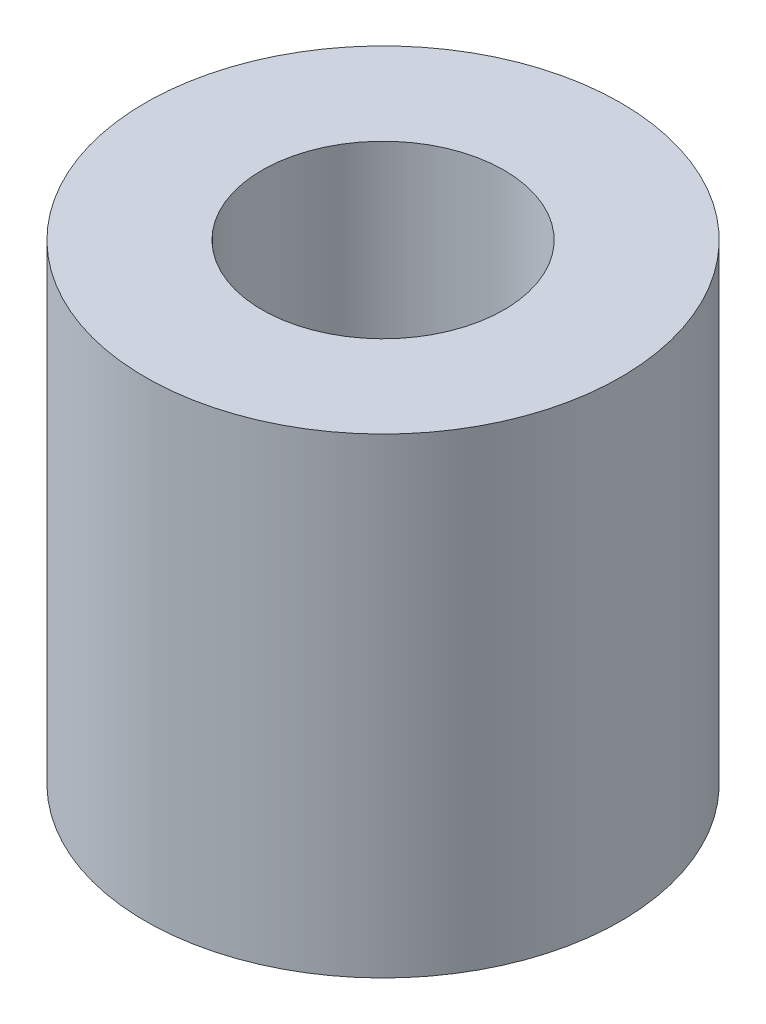
ISO-10303-21;
HEADER;
FILE_DESCRIPTION(('STEP AP214'),'2;1');
FILE_NAME('part.step','',(''),(''),'','','');
FILE_SCHEMA(('AUTOMOTIVE_DESIGN { 1 0 10303 214 1 1 1 1 }'));
ENDSEC;
DATA;
#1=APPLICATION_CONTEXT('core data for automotive mechanical design processes');
#2=APPLICATION_PROTOCOL_DEFINITION('international standard','automotive_design',2000,#1);
#3=PRODUCT_CONTEXT('',#1,'mechanical');
#4=PRODUCT('Part','Part','',(#3));
#5=PRODUCT_RELATED_PRODUCT_CATEGORY('part','',(#4));
#6=PRODUCT_DEFINITION_FORMATION('','',#4);
#7=PRODUCT_DEFINITION_CONTEXT('part definition',#1,'design');
#8=PRODUCT_DEFINITION('design','',#6,#7);
#9=PRODUCT_DEFINITION_SHAPE('','',#8);
#10=(LENGTH_UNIT() NAMED_UNIT(*) SI_UNIT(.MILLI.,.METRE.));
#11=(NAMED_UNIT(*) PLANE_ANGLE_UNIT() SI_UNIT($,.RADIAN.));
#12=(NAMED_UNIT(*) SI_UNIT($,.STERADIAN.) SOLID_ANGLE_UNIT());
#13=UNCERTAINTY_MEASURE_WITH_UNIT(LENGTH_MEASURE(1.E-05),#10,'distance_accuracy_value','');
#14=(GEOMETRIC_REPRESENTATION_CONTEXT(3) GLOBAL_UNCERTAINTY_ASSIGNED_CONTEXT((#13)) GLOBAL_UNIT_ASSIGNED_CONTEXT((#10,
#11,#12)) REPRESENTATION_CONTEXT('',''));
#15=CARTESIAN_POINT('',(0.,0.,0.));
#16=DIRECTION('',(0.,0.,1.));
#17=DIRECTION('',(1.,0.,0.));
#18=AXIS2_PLACEMENT_3D('',#15,#16,#17);
#19=CARTESIAN_POINT('',(0.,8.3058,0.));
#20=DIRECTION('',(0.,-1.,0.));
#21=DIRECTION('',(0.,0.,-1.));
#22=AXIS2_PLACEMENT_3D('',#19,#20,#21);
#23=CYLINDRICAL_SURFACE('',#22,2.1336);
#24=CARTESIAN_POINT('',(0.,0.,0.));
#25=DIRECTION('',(0.,-1.,0.));
#26=DIRECTION('',(0.,0.,-1.));
#27=AXIS2_PLACEMENT_3D('',#24,#25,#26);
#28=CIRCLE('',#27,2.1336);
#29=CARTESIAN_POINT('',(0.,0.,-2.1336));
#30=VERTEX_POINT('',#29);
#31=EDGE_CURVE('E28',#30,#30,#28,.T.);
#32=ORIENTED_EDGE('',*,*,#31,.T.);
#33=EDGE_LOOP('',(#32));
#34=FACE_BOUND('',#33,.T.);
#35=CARTESIAN_POINT('',(0.,8.3058,0.));
#36=DIRECTION('',(0.,-1.,0.));
#37=DIRECTION('',(0.,0.,-1.));
#38=AXIS2_PLACEMENT_3D('',#35,#36,#37);
#39=CIRCLE('',#38,2.1336);
#40=CARTESIAN_POINT('',(0.,8.3058,-2.1336));
#41=VERTEX_POINT('',#40);
#42=EDGE_CURVE('E19',#41,#41,#39,.T.);
#43=ORIENTED_EDGE('',*,*,#42,.F.);
#44=EDGE_LOOP('',(#43));
#45=FACE_BOUND('',#44,.T.);
#46=ADVANCED_FACE('F16',(#34,#45),#23,.F.);
#47=CARTESIAN_POINT('',(0.,8.3058,0.));
#48=DIRECTION('',(0.,1.,0.));
#49=DIRECTION('',(0.,0.,1.));
#50=AXIS2_PLACEMENT_3D('',#47,#48,#49);
#51=PLANE('',#50);
#52=ORIENTED_EDGE('',*,*,#42,.T.);
#53=EDGE_LOOP('',(#52));
#54=FACE_BOUND('',#53,.T.);
#55=CARTESIAN_POINT('',(0.,8.3058,0.));
#56=DIRECTION('',(0.,-1.,0.));
#57=DIRECTION('',(0.,0.,-1.));
#58=AXIS2_PLACEMENT_3D('',#55,#56,#57);
#59=CIRCLE('',#58,4.191);
#60=CARTESIAN_POINT('',(0.,8.3058,-4.191));
#61=VERTEX_POINT('',#60);
#62=EDGE_CURVE('E23',#61,#61,#59,.T.);
#63=ORIENTED_EDGE('',*,*,#62,.F.);
#64=EDGE_LOOP('',(#63));
#65=FACE_BOUND('',#64,.T.);
#66=ADVANCED_FACE('F36',(#54,#65),#51,.T.);
#67=CARTESIAN_POINT('',(0.,0.,0.));
#68=DIRECTION('',(0.,1.,0.));
#69=DIRECTION('',(0.,0.,1.));
#70=AXIS2_PLACEMENT_3D('',#67,#68,#69);
#71=PLANE('',#70);
#72=ORIENTED_EDGE('',*,*,#31,.F.);
#73=EDGE_LOOP('',(#72));
#74=FACE_BOUND('',#73,.T.);
#75=CARTESIAN_POINT('',(0.,0.,0.));
#76=DIRECTION('',(0.,-1.,0.));
#77=DIRECTION('',(0.,0.,-1.));
#78=AXIS2_PLACEMENT_3D('',#75,#76,#77);
#79=CIRCLE('',#78,4.191);
#80=CARTESIAN_POINT('',(0.,0.,-4.191));
#81=VERTEX_POINT('',#80);
#82=EDGE_CURVE('E10',#81,#81,#79,.F.);
#83=ORIENTED_EDGE('',*,*,#82,.F.);
#84=EDGE_LOOP('',(#83));
#85=FACE_BOUND('',#84,.T.);
#86=ADVANCED_FACE('F43',(#74,#85),#71,.F.);
#87=CARTESIAN_POINT('',(0.,8.3058,0.));
#88=DIRECTION('',(0.,-1.,0.));
#89=DIRECTION('',(0.,0.,-1.));
#90=AXIS2_PLACEMENT_3D('',#87,#88,#89);
#91=CYLINDRICAL_SURFACE('',#90,4.191);
#92=ORIENTED_EDGE('',*,*,#62,.T.);
#93=EDGE_LOOP('',(#92));
#94=FACE_BOUND('',#93,.T.);
#95=ORIENTED_EDGE('',*,*,#82,.T.);
#96=EDGE_LOOP('',(#95));
#97=FACE_BOUND('',#96,.T.);
#98=ADVANCED_FACE('F44',(#94,#97),#91,.T.);
#99=CLOSED_SHELL('',(#46,#66,#86,#98));
#100=MANIFOLD_SOLID_BREP('B1',#99);
#101=ADVANCED_BREP_SHAPE_REPRESENTATION('',(#18,#100),#14);
#102=SHAPE_DEFINITION_REPRESENTATION(#9,#101);
ENDSEC;
END-ISO-10303-21;
